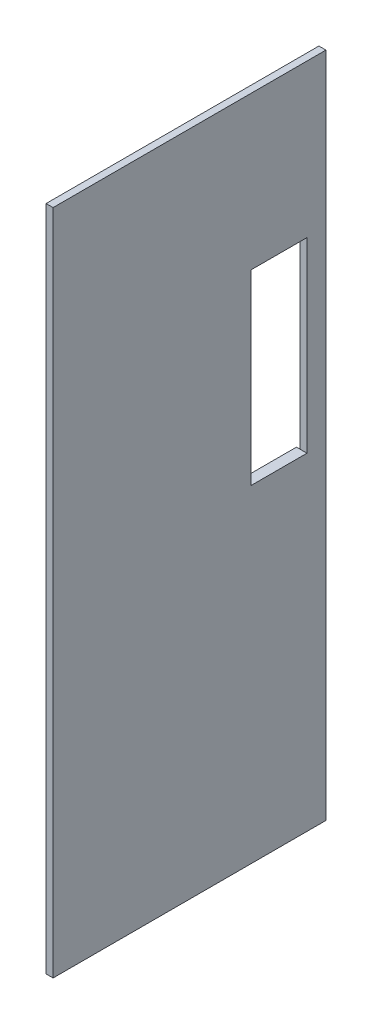
ISO-10303-21;
HEADER;
FILE_DESCRIPTION(('STEP AP214'),'2;1');
FILE_NAME('part.step','',(''),(''),'','','');
FILE_SCHEMA(('AUTOMOTIVE_DESIGN { 1 0 10303 214 1 1 1 1 }'));
ENDSEC;
DATA;
#1=APPLICATION_CONTEXT('core data for automotive mechanical design processes');
#2=APPLICATION_PROTOCOL_DEFINITION('international standard','automotive_design',2000,#1);
#3=PRODUCT_CONTEXT('',#1,'mechanical');
#4=PRODUCT('Part','Part','',(#3));
#5=PRODUCT_RELATED_PRODUCT_CATEGORY('part','',(#4));
#6=PRODUCT_DEFINITION_FORMATION('','',#4);
#7=PRODUCT_DEFINITION_CONTEXT('part definition',#1,'design');
#8=PRODUCT_DEFINITION('design','',#6,#7);
#9=PRODUCT_DEFINITION_SHAPE('','',#8);
#10=(LENGTH_UNIT() NAMED_UNIT(*) SI_UNIT(.MILLI.,.METRE.));
#11=(NAMED_UNIT(*) PLANE_ANGLE_UNIT() SI_UNIT($,.RADIAN.));
#12=(NAMED_UNIT(*) SI_UNIT($,.STERADIAN.) SOLID_ANGLE_UNIT());
#13=UNCERTAINTY_MEASURE_WITH_UNIT(LENGTH_MEASURE(1.E-05),#10,'distance_accuracy_value','');
#14=(GEOMETRIC_REPRESENTATION_CONTEXT(3) GLOBAL_UNCERTAINTY_ASSIGNED_CONTEXT((#13)) GLOBAL_UNIT_ASSIGNED_CONTEXT((#10,
#11,#12)) REPRESENTATION_CONTEXT('',''));
#15=CARTESIAN_POINT('',(0.,0.,0.));
#16=DIRECTION('',(0.,0.,1.));
#17=DIRECTION('',(1.,0.,0.));
#18=AXIS2_PLACEMENT_3D('',#15,#16,#17);
#19=CARTESIAN_POINT('',(0.,8.55000000000011,6.10000000000003));
#20=DIRECTION('',(0.,0.,1.));
#21=DIRECTION('',(0.,-1.,0.));
#22=AXIS2_PLACEMENT_3D('',#19,#20,#21);
#23=PLANE('',#22);
#24=DIRECTION('',(0.,-1.,0.));
#25=VECTOR('',#24,1.);
#26=CARTESIAN_POINT('',(0.,8.55000000000011,6.10000000000003));
#27=LINE('',#26,#25);
#28=CARTESIAN_POINT('',(0.,52.4873374800858,6.10000000000002));
#29=VERTEX_POINT('',#28);
#30=CARTESIAN_POINT('',(0.,8.55000000000011,6.10000000000003));
#31=VERTEX_POINT('',#30);
#32=EDGE_CURVE('E151',#29,#31,#27,.T.);
#33=ORIENTED_EDGE('',*,*,#32,.F.);
#34=DIRECTION('',(-1.,0.,0.));
#35=VECTOR('',#34,1.);
#36=CARTESIAN_POINT('',(2.,52.4873374800858,6.10000000000002));
#37=LINE('',#36,#35);
#38=CARTESIAN_POINT('',(0.5,52.4873374800858,6.10000000000002));
#39=VERTEX_POINT('',#38);
#40=EDGE_CURVE('E287',#39,#29,#37,.T.);
#41=ORIENTED_EDGE('',*,*,#40,.F.);
#42=DIRECTION('',(0.,-1.,0.));
#43=VECTOR('',#42,1.);
#44=CARTESIAN_POINT('',(0.5,8.55000000000011,6.10000000000003));
#45=LINE('',#44,#43);
#46=CARTESIAN_POINT('',(0.5,8.55000000000011,6.10000000000003));
#47=VERTEX_POINT('',#46);
#48=EDGE_CURVE('E165',#39,#47,#45,.T.);
#49=ORIENTED_EDGE('',*,*,#48,.T.);
#50=DIRECTION('',(1.,0.,0.));
#51=VECTOR('',#50,1.);
#52=CARTESIAN_POINT('',(0.,8.55000000000011,6.10000000000003));
#53=LINE('',#52,#51);
#54=EDGE_CURVE('E173',#31,#47,#53,.T.);
#55=ORIENTED_EDGE('',*,*,#54,.F.);
#56=EDGE_LOOP('',(#33,#41,#49,#55));
#57=FACE_BOUND('',#56,.T.);
#58=ADVANCED_FACE('F34',(#57),#23,.F.);
#59=CARTESIAN_POINT('',(1.5,5.85000000000011,3.40000000000003));
#60=DIRECTION('',(0.,-1.,0.));
#61=DIRECTION('',(0.,0.,-1.));
#62=AXIS2_PLACEMENT_3D('',#59,#60,#61);
#63=PLANE('',#62);
#64=DIRECTION('',(0.,0.,1.));
#65=VECTOR('',#64,1.);
#66=CARTESIAN_POINT('',(0.5,5.85000000000011,3.40000000000003));
#67=LINE('',#66,#65);
#68=CARTESIAN_POINT('',(0.5,5.85000000000011,3.40000000000003));
#69=VERTEX_POINT('',#68);
#70=CARTESIAN_POINT('',(0.5,5.85000000000012,42.25));
#71=VERTEX_POINT('',#70);
#72=EDGE_CURVE('E181',#69,#71,#67,.T.);
#73=ORIENTED_EDGE('',*,*,#72,.F.);
#74=DIRECTION('',(-1.,0.,0.));
#75=VECTOR('',#74,1.);
#76=CARTESIAN_POINT('',(1.5,5.85000000000011,3.40000000000003));
#77=LINE('',#76,#75);
#78=CARTESIAN_POINT('',(1.5,5.85000000000011,3.40000000000003));
#79=VERTEX_POINT('',#78);
#80=EDGE_CURVE('E11',#79,#69,#77,.T.);
#81=ORIENTED_EDGE('',*,*,#80,.F.);
#82=DIRECTION('',(0.,0.,1.));
#83=VECTOR('',#82,1.);
#84=CARTESIAN_POINT('',(1.5,5.85000000000011,3.40000000000003));
#85=LINE('',#84,#83);
#86=CARTESIAN_POINT('',(1.5,5.85000000000012,42.25));
#87=VERTEX_POINT('',#86);
#88=EDGE_CURVE('E182',#79,#87,#85,.T.);
#89=ORIENTED_EDGE('',*,*,#88,.T.);
#90=DIRECTION('',(-1.,0.,0.));
#91=VECTOR('',#90,1.);
#92=CARTESIAN_POINT('',(1.5,5.85000000000012,42.25));
#93=LINE('',#92,#91);
#94=EDGE_CURVE('E38',#87,#71,#93,.T.);
#95=ORIENTED_EDGE('',*,*,#94,.T.);
#96=EDGE_LOOP('',(#73,#81,#89,#95));
#97=FACE_BOUND('',#96,.T.);
#98=ADVANCED_FACE('F36',(#97),#63,.T.);
#99=CARTESIAN_POINT('',(1.5,100.85,3.40000000000002));
#100=DIRECTION('',(0.,0.,-1.));
#101=DIRECTION('',(0.,1.,0.));
#102=AXIS2_PLACEMENT_3D('',#99,#100,#101);
#103=PLANE('',#102);
#104=DIRECTION('',(0.,-1.,0.));
#105=VECTOR('',#104,1.);
#106=CARTESIAN_POINT('',(0.5,100.85,3.40000000000002));
#107=LINE('',#106,#105);
#108=CARTESIAN_POINT('',(0.5,100.85,3.40000000000002));
#109=VERTEX_POINT('',#108);
#110=EDGE_CURVE('E186',#109,#69,#107,.T.);
#111=ORIENTED_EDGE('',*,*,#110,.F.);
#112=DIRECTION('',(-1.,0.,0.));
#113=VECTOR('',#112,1.);
#114=CARTESIAN_POINT('',(1.5,100.85,3.40000000000002));
#115=LINE('',#114,#113);
#116=CARTESIAN_POINT('',(1.5,100.85,3.40000000000002));
#117=VERTEX_POINT('',#116);
#118=EDGE_CURVE('E43',#117,#109,#115,.T.);
#119=ORIENTED_EDGE('',*,*,#118,.F.);
#120=DIRECTION('',(0.,-1.,0.));
#121=VECTOR('',#120,1.);
#122=CARTESIAN_POINT('',(1.5,100.85,3.40000000000002));
#123=LINE('',#122,#121);
#124=EDGE_CURVE('E192',#117,#79,#123,.T.);
#125=ORIENTED_EDGE('',*,*,#124,.T.);
#126=ORIENTED_EDGE('',*,*,#80,.T.);
#127=EDGE_LOOP('',(#111,#119,#125,#126));
#128=FACE_BOUND('',#127,.T.);
#129=ADVANCED_FACE('F218',(#128),#103,.T.);
#130=CARTESIAN_POINT('',(1.5,100.85,42.25));
#131=DIRECTION('',(0.,1.,0.));
#132=DIRECTION('',(0.,0.,1.));
#133=AXIS2_PLACEMENT_3D('',#130,#131,#132);
#134=PLANE('',#133);
#135=DIRECTION('',(0.,0.,-1.));
#136=VECTOR('',#135,1.);
#137=CARTESIAN_POINT('',(0.5,100.85,42.25));
#138=LINE('',#137,#136);
#139=CARTESIAN_POINT('',(0.5,100.85,42.25));
#140=VERTEX_POINT('',#139);
#141=EDGE_CURVE('E200',#140,#109,#138,.T.);
#142=ORIENTED_EDGE('',*,*,#141,.F.);
#143=DIRECTION('',(-1.,0.,0.));
#144=VECTOR('',#143,1.);
#145=CARTESIAN_POINT('',(1.5,100.85,42.25));
#146=LINE('',#145,#144);
#147=CARTESIAN_POINT('',(1.5,100.85,42.25));
#148=VERTEX_POINT('',#147);
#149=EDGE_CURVE('E205',#148,#140,#146,.T.);
#150=ORIENTED_EDGE('',*,*,#149,.F.);
#151=DIRECTION('',(0.,0.,-1.));
#152=VECTOR('',#151,1.);
#153=CARTESIAN_POINT('',(1.5,100.85,42.25));
#154=LINE('',#153,#152);
#155=EDGE_CURVE('E189',#148,#117,#154,.T.);
#156=ORIENTED_EDGE('',*,*,#155,.T.);
#157=ORIENTED_EDGE('',*,*,#118,.T.);
#158=EDGE_LOOP('',(#142,#150,#156,#157));
#159=FACE_BOUND('',#158,.T.);
#160=ADVANCED_FACE('F224',(#159),#134,.T.);
#161=CARTESIAN_POINT('',(1.5,5.85000000000012,42.25));
#162=DIRECTION('',(0.,0.,1.));
#163=DIRECTION('',(0.,-1.,0.));
#164=AXIS2_PLACEMENT_3D('',#161,#162,#163);
#165=PLANE('',#164);
#166=DIRECTION('',(0.,1.,0.));
#167=VECTOR('',#166,1.);
#168=CARTESIAN_POINT('',(0.5,5.85000000000012,42.25));
#169=LINE('',#168,#167);
#170=EDGE_CURVE('E197',#71,#140,#169,.T.);
#171=ORIENTED_EDGE('',*,*,#170,.F.);
#172=ORIENTED_EDGE('',*,*,#94,.F.);
#173=DIRECTION('',(0.,1.,0.));
#174=VECTOR('',#173,1.);
#175=CARTESIAN_POINT('',(1.5,5.85000000000012,42.25));
#176=LINE('',#175,#174);
#177=EDGE_CURVE('E185',#87,#148,#176,.T.);
#178=ORIENTED_EDGE('',*,*,#177,.T.);
#179=ORIENTED_EDGE('',*,*,#149,.T.);
#180=EDGE_LOOP('',(#171,#172,#178,#179));
#181=FACE_BOUND('',#180,.T.);
#182=ADVANCED_FACE('F213',(#181),#165,.T.);
#183=CARTESIAN_POINT('',(1.5,0.,0.));
#184=DIRECTION('',(-1.,0.,0.));
#185=DIRECTION('',(0.,0.,1.));
#186=AXIS2_PLACEMENT_3D('',#183,#184,#185);
#187=PLANE('',#186);
#188=DIRECTION('',(0.,0.,1.));
#189=VECTOR('',#188,1.);
#190=CARTESIAN_POINT('',(1.5,52.4873374800858,0.));
#191=LINE('',#190,#189);
#192=CARTESIAN_POINT('',(1.5,52.4873374800858,6.10000000000002));
#193=VERTEX_POINT('',#192);
#194=CARTESIAN_POINT('',(1.5,52.4873374800858,14.0541763020413));
#195=VERTEX_POINT('',#194);
#196=EDGE_CURVE('E274',#193,#195,#191,.T.);
#197=ORIENTED_EDGE('',*,*,#196,.T.);
#198=DIRECTION('',(0.,1.,0.));
#199=VECTOR('',#198,1.);
#200=CARTESIAN_POINT('',(1.5,0.,14.0541763020413));
#201=LINE('',#200,#199);
#202=CARTESIAN_POINT('',(1.5,79.0742196847353,14.0541763020413));
#203=VERTEX_POINT('',#202);
#204=EDGE_CURVE('E162',#195,#203,#201,.T.);
#205=ORIENTED_EDGE('',*,*,#204,.T.);
#206=DIRECTION('',(0.,0.,-1.));
#207=VECTOR('',#206,1.);
#208=CARTESIAN_POINT('',(1.5,79.0742196847353,0.));
#209=LINE('',#208,#207);
#210=CARTESIAN_POINT('',(1.5,79.0742196847353,6.10000000000002));
#211=VERTEX_POINT('',#210);
#212=EDGE_CURVE('E282',#203,#211,#209,.T.);
#213=ORIENTED_EDGE('',*,*,#212,.T.);
#214=DIRECTION('',(0.,-1.,0.));
#215=VECTOR('',#214,1.);
#216=CARTESIAN_POINT('',(1.5,0.,6.10000000000003));
#217=LINE('',#216,#215);
#218=EDGE_CURVE('E277',#211,#193,#217,.T.);
#219=ORIENTED_EDGE('',*,*,#218,.T.);
#220=EDGE_LOOP('',(#197,#205,#213,#219));
#221=FACE_BOUND('',#220,.T.);
#222=ORIENTED_EDGE('',*,*,#88,.F.);
#223=ORIENTED_EDGE('',*,*,#124,.F.);
#224=ORIENTED_EDGE('',*,*,#155,.F.);
#225=ORIENTED_EDGE('',*,*,#177,.F.);
#226=EDGE_LOOP('',(#222,#223,#224,#225));
#227=FACE_BOUND('',#226,.T.);
#228=ADVANCED_FACE('F221',(#221,#227),#187,.F.);
#229=CARTESIAN_POINT('',(0.5,0.,0.));
#230=DIRECTION('',(-1.,0.,0.));
#231=DIRECTION('',(0.,0.,1.));
#232=AXIS2_PLACEMENT_3D('',#229,#230,#231);
#233=PLANE('',#232);
#234=DIRECTION('',(0.,1.,0.));
#235=VECTOR('',#234,1.);
#236=CARTESIAN_POINT('',(0.5,98.1500000000001,39.55));
#237=LINE('',#236,#235);
#238=CARTESIAN_POINT('',(0.5,8.55000000000012,39.55));
#239=VERTEX_POINT('',#238);
#240=CARTESIAN_POINT('',(0.5,98.1500000000001,39.55));
#241=VERTEX_POINT('',#240);
#242=EDGE_CURVE('E158',#239,#241,#237,.T.);
#243=ORIENTED_EDGE('',*,*,#242,.F.);
#244=DIRECTION('',(0.,0.,1.));
#245=VECTOR('',#244,1.);
#246=CARTESIAN_POINT('',(0.5,8.55000000000012,39.55));
#247=LINE('',#246,#245);
#248=EDGE_CURVE('E167',#47,#239,#247,.T.);
#249=ORIENTED_EDGE('',*,*,#248,.F.);
#250=ORIENTED_EDGE('',*,*,#48,.F.);
#251=DIRECTION('',(0.,-1.,0.));
#252=VECTOR('',#251,1.);
#253=CARTESIAN_POINT('',(0.5,0.,6.10000000000003));
#254=LINE('',#253,#252);
#255=CARTESIAN_POINT('',(0.5,79.0742196847353,6.10000000000002));
#256=VERTEX_POINT('',#255);
#257=EDGE_CURVE('E280',#256,#39,#254,.T.);
#258=ORIENTED_EDGE('',*,*,#257,.F.);
#259=CARTESIAN_POINT('',(0.5,98.1500000000001,6.10000000000002));
#260=VERTEX_POINT('',#259);
#261=EDGE_CURVE('E144',#260,#256,#45,.T.);
#262=ORIENTED_EDGE('',*,*,#261,.F.);
#263=DIRECTION('',(0.,0.,-1.));
#264=VECTOR('',#263,1.);
#265=CARTESIAN_POINT('',(0.5,98.1500000000001,6.10000000000002));
#266=LINE('',#265,#264);
#267=EDGE_CURVE('E161',#241,#260,#266,.T.);
#268=ORIENTED_EDGE('',*,*,#267,.F.);
#269=EDGE_LOOP('',(#243,#249,#250,#258,#262,#268));
#270=FACE_BOUND('',#269,.T.);
#271=ORIENTED_EDGE('',*,*,#72,.T.);
#272=ORIENTED_EDGE('',*,*,#170,.T.);
#273=ORIENTED_EDGE('',*,*,#141,.T.);
#274=ORIENTED_EDGE('',*,*,#110,.T.);
#275=EDGE_LOOP('',(#271,#272,#273,#274));
#276=FACE_BOUND('',#275,.T.);
#277=ADVANCED_FACE('F215',(#270,#276),#233,.T.);
#278=CARTESIAN_POINT('',(0.,98.1500000000001,39.55));
#279=DIRECTION('',(0.,0.,-1.));
#280=DIRECTION('',(0.,1.,0.));
#281=AXIS2_PLACEMENT_3D('',#278,#279,#280);
#282=PLANE('',#281);
#283=ORIENTED_EDGE('',*,*,#242,.T.);
#284=DIRECTION('',(1.,0.,0.));
#285=VECTOR('',#284,1.);
#286=CARTESIAN_POINT('',(0.,98.1500000000001,39.55));
#287=LINE('',#286,#285);
#288=CARTESIAN_POINT('',(0.,98.1500000000001,39.55));
#289=VERTEX_POINT('',#288);
#290=EDGE_CURVE('E178',#289,#241,#287,.T.);
#291=ORIENTED_EDGE('',*,*,#290,.F.);
#292=DIRECTION('',(0.,1.,0.));
#293=VECTOR('',#292,1.);
#294=CARTESIAN_POINT('',(0.,98.1500000000001,39.55));
#295=LINE('',#294,#293);
#296=CARTESIAN_POINT('',(0.,8.55000000000012,39.55));
#297=VERTEX_POINT('',#296);
#298=EDGE_CURVE('E170',#297,#289,#295,.T.);
#299=ORIENTED_EDGE('',*,*,#298,.F.);
#300=DIRECTION('',(1.,0.,0.));
#301=VECTOR('',#300,1.);
#302=CARTESIAN_POINT('',(0.,8.55000000000012,39.55));
#303=LINE('',#302,#301);
#304=EDGE_CURVE('E153',#297,#239,#303,.T.);
#305=ORIENTED_EDGE('',*,*,#304,.T.);
#306=EDGE_LOOP('',(#283,#291,#299,#305));
#307=FACE_BOUND('',#306,.T.);
#308=ADVANCED_FACE('F249',(#307),#282,.F.);
#309=CARTESIAN_POINT('',(0.,98.1500000000001,6.10000000000002));
#310=DIRECTION('',(0.,-1.,0.));
#311=DIRECTION('',(0.,0.,-1.));
#312=AXIS2_PLACEMENT_3D('',#309,#310,#311);
#313=PLANE('',#312);
#314=ORIENTED_EDGE('',*,*,#267,.T.);
#315=DIRECTION('',(1.,0.,0.));
#316=VECTOR('',#315,1.);
#317=CARTESIAN_POINT('',(0.,98.1500000000001,6.10000000000002));
#318=LINE('',#317,#316);
#319=CARTESIAN_POINT('',(0.,98.1500000000001,6.10000000000002));
#320=VERTEX_POINT('',#319);
#321=EDGE_CURVE('E176',#320,#260,#318,.T.);
#322=ORIENTED_EDGE('',*,*,#321,.F.);
#323=DIRECTION('',(0.,0.,-1.));
#324=VECTOR('',#323,1.);
#325=CARTESIAN_POINT('',(0.,98.1500000000001,6.10000000000002));
#326=LINE('',#325,#324);
#327=EDGE_CURVE('E148',#289,#320,#326,.T.);
#328=ORIENTED_EDGE('',*,*,#327,.F.);
#329=ORIENTED_EDGE('',*,*,#290,.T.);
#330=EDGE_LOOP('',(#314,#322,#328,#329));
#331=FACE_BOUND('',#330,.T.);
#332=ADVANCED_FACE('F243',(#331),#313,.F.);
#333=ORIENTED_EDGE('',*,*,#261,.T.);
#334=DIRECTION('',(-1.,0.,0.));
#335=VECTOR('',#334,1.);
#336=CARTESIAN_POINT('',(2.,79.0742196847353,6.10000000000002));
#337=LINE('',#336,#335);
#338=CARTESIAN_POINT('',(0.,79.0742196847353,6.10000000000002));
#339=VERTEX_POINT('',#338);
#340=EDGE_CURVE('E132',#256,#339,#337,.T.);
#341=ORIENTED_EDGE('',*,*,#340,.T.);
#342=EDGE_CURVE('E143',#320,#339,#27,.T.);
#343=ORIENTED_EDGE('',*,*,#342,.F.);
#344=ORIENTED_EDGE('',*,*,#321,.T.);
#345=EDGE_LOOP('',(#333,#341,#343,#344));
#346=FACE_BOUND('',#345,.T.);
#347=ADVANCED_FACE('F141',(#346),#23,.F.);
#348=CARTESIAN_POINT('',(0.,8.55000000000012,39.55));
#349=DIRECTION('',(0.,1.,0.));
#350=DIRECTION('',(0.,0.,1.));
#351=AXIS2_PLACEMENT_3D('',#348,#349,#350);
#352=PLANE('',#351);
#353=ORIENTED_EDGE('',*,*,#248,.T.);
#354=ORIENTED_EDGE('',*,*,#304,.F.);
#355=DIRECTION('',(0.,0.,1.));
#356=VECTOR('',#355,1.);
#357=CARTESIAN_POINT('',(0.,8.55000000000012,39.55));
#358=LINE('',#357,#356);
#359=EDGE_CURVE('E150',#31,#297,#358,.T.);
#360=ORIENTED_EDGE('',*,*,#359,.F.);
#361=ORIENTED_EDGE('',*,*,#54,.T.);
#362=EDGE_LOOP('',(#353,#354,#360,#361));
#363=FACE_BOUND('',#362,.T.);
#364=ADVANCED_FACE('F242',(#363),#352,.F.);
#365=CARTESIAN_POINT('',(0.,0.,0.));
#366=DIRECTION('',(1.,0.,0.));
#367=DIRECTION('',(0.,0.,-1.));
#368=AXIS2_PLACEMENT_3D('',#365,#366,#367);
#369=PLANE('',#368);
#370=DIRECTION('',(0.,1.,0.));
#371=VECTOR('',#370,1.);
#372=CARTESIAN_POINT('',(0.,52.4873374800858,14.0541763020413));
#373=LINE('',#372,#371);
#374=CARTESIAN_POINT('',(0.,52.4873374800858,14.0541763020413));
#375=VERTEX_POINT('',#374);
#376=CARTESIAN_POINT('',(0.,79.0742196847353,14.0541763020413));
#377=VERTEX_POINT('',#376);
#378=EDGE_CURVE('E59',#375,#377,#373,.T.);
#379=ORIENTED_EDGE('',*,*,#378,.F.);
#380=DIRECTION('',(0.,0.,1.));
#381=VECTOR('',#380,1.);
#382=CARTESIAN_POINT('',(0.,52.4873374800858,14.0541763020413));
#383=LINE('',#382,#381);
#384=EDGE_CURVE('E136',#29,#375,#383,.T.);
#385=ORIENTED_EDGE('',*,*,#384,.F.);
#386=ORIENTED_EDGE('',*,*,#32,.T.);
#387=ORIENTED_EDGE('',*,*,#359,.T.);
#388=ORIENTED_EDGE('',*,*,#298,.T.);
#389=ORIENTED_EDGE('',*,*,#327,.T.);
#390=ORIENTED_EDGE('',*,*,#342,.T.);
#391=DIRECTION('',(0.,0.,-1.));
#392=VECTOR('',#391,1.);
#393=CARTESIAN_POINT('',(0.,79.0742196847353,14.0541763020413));
#394=LINE('',#393,#392);
#395=EDGE_CURVE('E129',#377,#339,#394,.T.);
#396=ORIENTED_EDGE('',*,*,#395,.F.);
#397=EDGE_LOOP('',(#379,#385,#386,#387,#388,#389,#390,#396));
#398=FACE_BOUND('',#397,.T.);
#399=ADVANCED_FACE('F146',(#398),#369,.F.);
#400=CARTESIAN_POINT('',(2.,52.4873374800858,14.0541763020413));
#401=DIRECTION('',(0.,0.,1.));
#402=DIRECTION('',(1.,0.,0.));
#403=AXIS2_PLACEMENT_3D('',#400,#401,#402);
#404=PLANE('',#403);
#405=DIRECTION('',(-1.,0.,0.));
#406=VECTOR('',#405,1.);
#407=CARTESIAN_POINT('',(2.,52.4873374800858,14.0541763020413));
#408=LINE('',#407,#406);
#409=EDGE_CURVE('E285',#195,#375,#408,.T.);
#410=ORIENTED_EDGE('',*,*,#409,.T.);
#411=ORIENTED_EDGE('',*,*,#378,.T.);
#412=DIRECTION('',(-1.,0.,0.));
#413=VECTOR('',#412,1.);
#414=CARTESIAN_POINT('',(2.,79.0742196847353,14.0541763020413));
#415=LINE('',#414,#413);
#416=EDGE_CURVE('E133',#203,#377,#415,.T.);
#417=ORIENTED_EDGE('',*,*,#416,.F.);
#418=ORIENTED_EDGE('',*,*,#204,.F.);
#419=EDGE_LOOP('',(#410,#411,#417,#418));
#420=FACE_BOUND('',#419,.T.);
#421=ADVANCED_FACE('F303',(#420),#404,.F.);
#422=CARTESIAN_POINT('',(2.,52.4873374800858,14.0541763020413));
#423=DIRECTION('',(0.,-1.,0.));
#424=DIRECTION('',(0.,0.,-1.));
#425=AXIS2_PLACEMENT_3D('',#422,#423,#424);
#426=PLANE('',#425);
#427=EDGE_CURVE('E289',#193,#39,#37,.T.);
#428=ORIENTED_EDGE('',*,*,#427,.T.);
#429=ORIENTED_EDGE('',*,*,#40,.T.);
#430=ORIENTED_EDGE('',*,*,#384,.T.);
#431=ORIENTED_EDGE('',*,*,#409,.F.);
#432=ORIENTED_EDGE('',*,*,#196,.F.);
#433=EDGE_LOOP('',(#428,#429,#430,#431,#432));
#434=FACE_BOUND('',#433,.T.);
#435=ADVANCED_FACE('F297',(#434),#426,.F.);
#436=CARTESIAN_POINT('',(2.,52.4873374800858,6.10000000000002));
#437=DIRECTION('',(0.,0.,-1.));
#438=DIRECTION('',(0.,1.,0.));
#439=AXIS2_PLACEMENT_3D('',#436,#437,#438);
#440=PLANE('',#439);
#441=EDGE_CURVE('E51',#211,#256,#337,.T.);
#442=ORIENTED_EDGE('',*,*,#441,.T.);
#443=ORIENTED_EDGE('',*,*,#257,.T.);
#444=ORIENTED_EDGE('',*,*,#427,.F.);
#445=ORIENTED_EDGE('',*,*,#218,.F.);
#446=EDGE_LOOP('',(#442,#443,#444,#445));
#447=FACE_BOUND('',#446,.T.);
#448=ADVANCED_FACE('F302',(#447),#440,.F.);
#449=CARTESIAN_POINT('',(2.,79.0742196847353,14.0541763020413));
#450=DIRECTION('',(0.,1.,0.));
#451=DIRECTION('',(0.,0.,1.));
#452=AXIS2_PLACEMENT_3D('',#449,#450,#451);
#453=PLANE('',#452);
#454=ORIENTED_EDGE('',*,*,#416,.T.);
#455=ORIENTED_EDGE('',*,*,#395,.T.);
#456=ORIENTED_EDGE('',*,*,#340,.F.);
#457=ORIENTED_EDGE('',*,*,#441,.F.);
#458=ORIENTED_EDGE('',*,*,#212,.F.);
#459=EDGE_LOOP('',(#454,#455,#456,#457,#458));
#460=FACE_BOUND('',#459,.T.);
#461=ADVANCED_FACE('F131',(#460),#453,.F.);
#462=CLOSED_SHELL('',(#58,#98,#129,#160,#182,#228,#277,#308,#332,#347,#364,#399,#421,#435,#448,#461));
#463=MANIFOLD_SOLID_BREP('B2',#462);
#464=ADVANCED_BREP_SHAPE_REPRESENTATION('',(#18,#463),#14);
#465=SHAPE_DEFINITION_REPRESENTATION(#9,#464);
ENDSEC;
END-ISO-10303-21;
